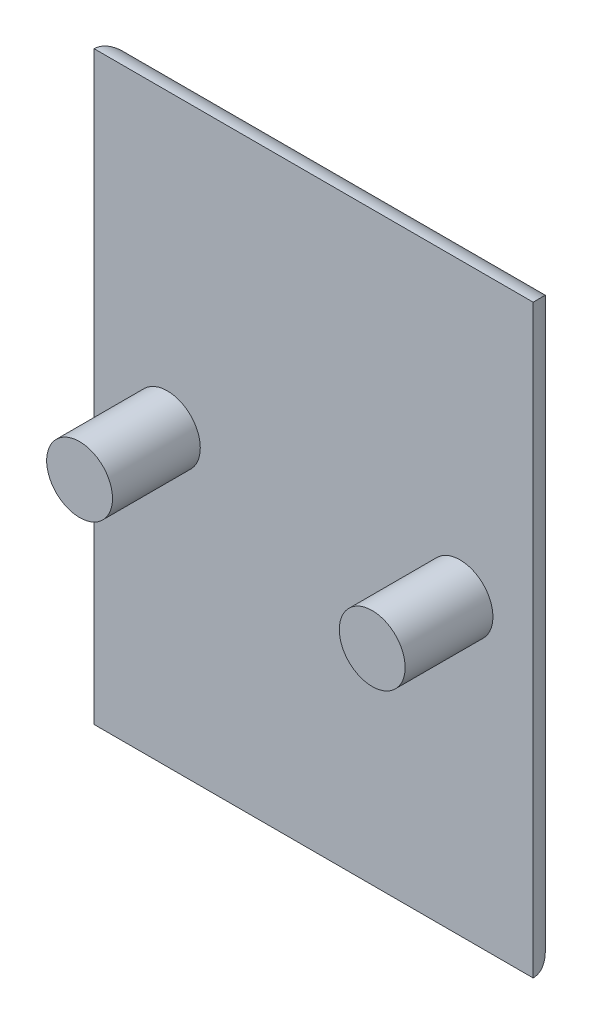
ISO-10303-21;
HEADER;
FILE_DESCRIPTION(('STEP AP214'),'2;1');
FILE_NAME('part.step','',(''),(''),'','','');
FILE_SCHEMA(('AUTOMOTIVE_DESIGN { 1 0 10303 214 1 1 1 1 }'));
ENDSEC;
DATA;
#1=APPLICATION_CONTEXT('core data for automotive mechanical design processes');
#2=APPLICATION_PROTOCOL_DEFINITION('international standard','automotive_design',2000,#1);
#3=PRODUCT_CONTEXT('',#1,'mechanical');
#4=PRODUCT('Part','Part','',(#3));
#5=PRODUCT_RELATED_PRODUCT_CATEGORY('part','',(#4));
#6=PRODUCT_DEFINITION_FORMATION('','',#4);
#7=PRODUCT_DEFINITION_CONTEXT('part definition',#1,'design');
#8=PRODUCT_DEFINITION('design','',#6,#7);
#9=PRODUCT_DEFINITION_SHAPE('','',#8);
#10=(LENGTH_UNIT() NAMED_UNIT(*) SI_UNIT(.MILLI.,.METRE.));
#11=(NAMED_UNIT(*) PLANE_ANGLE_UNIT() SI_UNIT($,.RADIAN.));
#12=(NAMED_UNIT(*) SI_UNIT($,.STERADIAN.) SOLID_ANGLE_UNIT());
#13=UNCERTAINTY_MEASURE_WITH_UNIT(LENGTH_MEASURE(1.E-05),#10,'distance_accuracy_value','');
#14=(GEOMETRIC_REPRESENTATION_CONTEXT(3) GLOBAL_UNCERTAINTY_ASSIGNED_CONTEXT((#13)) GLOBAL_UNIT_ASSIGNED_CONTEXT((#10,
#11,#12)) REPRESENTATION_CONTEXT('',''));
#15=CARTESIAN_POINT('',(0.,0.,0.));
#16=DIRECTION('',(0.,0.,1.));
#17=DIRECTION('',(1.,0.,0.));
#18=AXIS2_PLACEMENT_3D('',#15,#16,#17);
#19=CARTESIAN_POINT('',(0.,0.,2.));
#20=DIRECTION('',(0.,0.,1.));
#21=DIRECTION('',(1.,0.,0.));
#22=AXIS2_PLACEMENT_3D('',#19,#20,#21);
#23=PLANE('',#22);
#24=CARTESIAN_POINT('',(-10.,0.,2.));
#25=DIRECTION('',(0.,0.,1.));
#26=DIRECTION('',(1.,0.,0.));
#27=AXIS2_PLACEMENT_3D('',#24,#25,#26);
#28=CIRCLE('',#27,2.25);
#29=CARTESIAN_POINT('',(-7.75,0.,2.));
#30=VERTEX_POINT('',#29);
#31=EDGE_CURVE('E94',#30,#30,#28,.T.);
#32=ORIENTED_EDGE('',*,*,#31,.F.);
#33=EDGE_LOOP('',(#32));
#34=FACE_BOUND('',#33,.T.);
#35=DIRECTION('',(0.,1.,0.));
#36=VECTOR('',#35,1.);
#37=CARTESIAN_POINT('',(15.,20.,2.));
#38=LINE('',#37,#36);
#39=CARTESIAN_POINT('',(15.,-20.,2.));
#40=VERTEX_POINT('',#39);
#41=CARTESIAN_POINT('',(15.,20.,2.));
#42=VERTEX_POINT('',#41);
#43=EDGE_CURVE('E84',#40,#42,#38,.T.);
#44=ORIENTED_EDGE('',*,*,#43,.T.);
#45=DIRECTION('',(-1.,0.,0.));
#46=VECTOR('',#45,1.);
#47=CARTESIAN_POINT('',(-15.,20.,2.));
#48=LINE('',#47,#46);
#49=CARTESIAN_POINT('',(-15.,20.,2.));
#50=VERTEX_POINT('',#49);
#51=EDGE_CURVE('E88',#42,#50,#48,.T.);
#52=ORIENTED_EDGE('',*,*,#51,.T.);
#53=DIRECTION('',(0.,-1.,0.));
#54=VECTOR('',#53,1.);
#55=CARTESIAN_POINT('',(-15.,20.,2.));
#56=LINE('',#55,#54);
#57=CARTESIAN_POINT('',(-15.,-20.,2.));
#58=VERTEX_POINT('',#57);
#59=EDGE_CURVE('E107',#50,#58,#56,.T.);
#60=ORIENTED_EDGE('',*,*,#59,.T.);
#61=DIRECTION('',(1.,0.,0.));
#62=VECTOR('',#61,1.);
#63=CARTESIAN_POINT('',(-15.,-20.,2.));
#64=LINE('',#63,#62);
#65=EDGE_CURVE('E90',#58,#40,#64,.T.);
#66=ORIENTED_EDGE('',*,*,#65,.T.);
#67=EDGE_LOOP('',(#44,#52,#60,#66));
#68=FACE_BOUND('',#67,.T.);
#69=CARTESIAN_POINT('',(10.,0.,2.));
#70=DIRECTION('',(0.,0.,1.));
#71=DIRECTION('',(-1.,0.,0.));
#72=AXIS2_PLACEMENT_3D('',#69,#70,#71);
#73=CIRCLE('',#72,2.25);
#74=CARTESIAN_POINT('',(7.75,0.,2.));
#75=VERTEX_POINT('',#74);
#76=EDGE_CURVE('E125',#75,#75,#73,.T.);
#77=ORIENTED_EDGE('',*,*,#76,.F.);
#78=EDGE_LOOP('',(#77));
#79=FACE_BOUND('',#78,.T.);
#80=ADVANCED_FACE('F43',(#34,#68,#79),#23,.T.);
#81=CARTESIAN_POINT('',(0.,0.,0.));
#82=DIRECTION('',(0.,0.,1.));
#83=DIRECTION('',(1.,0.,0.));
#84=AXIS2_PLACEMENT_3D('',#81,#82,#83);
#85=PLANE('',#84);
#86=DIRECTION('',(0.,-1.,0.));
#87=VECTOR('',#86,1.);
#88=CARTESIAN_POINT('',(-13.,0.,0.));
#89=LINE('',#88,#87);
#90=CARTESIAN_POINT('',(-13.,-18.,0.));
#91=VERTEX_POINT('',#90);
#92=CARTESIAN_POINT('',(-13.,18.,0.));
#93=VERTEX_POINT('',#92);
#94=EDGE_CURVE('E52',#91,#93,#89,.F.);
#95=ORIENTED_EDGE('',*,*,#94,.T.);
#96=DIRECTION('',(-1.,0.,0.));
#97=VECTOR('',#96,1.);
#98=CARTESIAN_POINT('',(0.,18.,0.));
#99=LINE('',#98,#97);
#100=CARTESIAN_POINT('',(13.,18.,0.));
#101=VERTEX_POINT('',#100);
#102=EDGE_CURVE('E11',#93,#101,#99,.F.);
#103=ORIENTED_EDGE('',*,*,#102,.T.);
#104=DIRECTION('',(0.,1.,0.));
#105=VECTOR('',#104,1.);
#106=CARTESIAN_POINT('',(13.,0.,0.));
#107=LINE('',#106,#105);
#108=CARTESIAN_POINT('',(13.,-18.,0.));
#109=VERTEX_POINT('',#108);
#110=EDGE_CURVE('E99',#101,#109,#107,.F.);
#111=ORIENTED_EDGE('',*,*,#110,.T.);
#112=DIRECTION('',(1.,0.,0.));
#113=VECTOR('',#112,1.);
#114=CARTESIAN_POINT('',(0.,-18.,0.));
#115=LINE('',#114,#113);
#116=EDGE_CURVE('E63',#109,#91,#115,.F.);
#117=ORIENTED_EDGE('',*,*,#116,.T.);
#118=EDGE_LOOP('',(#95,#103,#111,#117));
#119=FACE_BOUND('',#118,.T.);
#120=ADVANCED_FACE('F136',(#119),#85,.F.);
#121=CARTESIAN_POINT('',(10.,0.,8.));
#122=DIRECTION('',(0.,0.,-1.));
#123=DIRECTION('',(-1.,0.,0.));
#124=AXIS2_PLACEMENT_3D('',#121,#122,#123);
#125=CYLINDRICAL_SURFACE('',#124,2.25);
#126=ORIENTED_EDGE('',*,*,#76,.T.);
#127=EDGE_LOOP('',(#126));
#128=FACE_BOUND('',#127,.T.);
#129=CARTESIAN_POINT('',(10.,0.,8.));
#130=DIRECTION('',(0.,0.,1.));
#131=DIRECTION('',(1.,0.,0.));
#132=AXIS2_PLACEMENT_3D('',#129,#130,#131);
#133=CIRCLE('',#132,2.25);
#134=CARTESIAN_POINT('',(12.25,0.,8.));
#135=VERTEX_POINT('',#134);
#136=EDGE_CURVE('E118',#135,#135,#133,.F.);
#137=ORIENTED_EDGE('',*,*,#136,.T.);
#138=EDGE_LOOP('',(#137));
#139=FACE_BOUND('',#138,.T.);
#140=ADVANCED_FACE('F142',(#128,#139),#125,.T.);
#141=CARTESIAN_POINT('',(0.,0.,8.));
#142=DIRECTION('',(0.,0.,1.));
#143=DIRECTION('',(1.,0.,0.));
#144=AXIS2_PLACEMENT_3D('',#141,#142,#143);
#145=PLANE('',#144);
#146=ORIENTED_EDGE('',*,*,#136,.F.);
#147=EDGE_LOOP('',(#146));
#148=FACE_BOUND('',#147,.T.);
#149=ADVANCED_FACE('F164',(#148),#145,.T.);
#150=CARTESIAN_POINT('',(-10.,0.,8.));
#151=DIRECTION('',(0.,0.,-1.));
#152=DIRECTION('',(-1.,0.,0.));
#153=AXIS2_PLACEMENT_3D('',#150,#151,#152);
#154=CYLINDRICAL_SURFACE('',#153,2.25);
#155=ORIENTED_EDGE('',*,*,#31,.T.);
#156=EDGE_LOOP('',(#155));
#157=FACE_BOUND('',#156,.T.);
#158=CARTESIAN_POINT('',(-10.,0.,8.));
#159=DIRECTION('',(0.,0.,1.));
#160=DIRECTION('',(1.,0.,0.));
#161=AXIS2_PLACEMENT_3D('',#158,#159,#160);
#162=CIRCLE('',#161,2.25);
#163=CARTESIAN_POINT('',(-7.75,0.,8.));
#164=VERTEX_POINT('',#163);
#165=EDGE_CURVE('E120',#164,#164,#162,.T.);
#166=ORIENTED_EDGE('',*,*,#165,.F.);
#167=EDGE_LOOP('',(#166));
#168=FACE_BOUND('',#167,.T.);
#169=ADVANCED_FACE('F132',(#157,#168),#154,.T.);
#170=CARTESIAN_POINT('',(0.,0.,8.));
#171=DIRECTION('',(0.,0.,1.));
#172=DIRECTION('',(1.,0.,0.));
#173=AXIS2_PLACEMENT_3D('',#170,#171,#172);
#174=PLANE('',#173);
#175=ORIENTED_EDGE('',*,*,#165,.T.);
#176=EDGE_LOOP('',(#175));
#177=FACE_BOUND('',#176,.T.);
#178=ADVANCED_FACE('F155',(#177),#174,.T.);
#179=CARTESIAN_POINT('',(-15.,-18.,2.));
#180=DIRECTION('',(1.,0.,0.));
#181=DIRECTION('',(0.,0.,-1.));
#182=AXIS2_PLACEMENT_3D('',#179,#180,#181);
#183=CYLINDRICAL_SURFACE('',#182,2.);
#184=CARTESIAN_POINT('',(-13.,-18.,2.));
#185=DIRECTION('',(0.707106781186547,-0.707106781186547,0.));
#186=DIRECTION('',(0.707106781186547,0.707106781186547,0.));
#187=AXIS2_PLACEMENT_3D('',#184,#185,#186);
#188=ELLIPSE('',#187,2.82842712474619,2.);
#189=EDGE_CURVE('E101',#91,#58,#188,.F.);
#190=ORIENTED_EDGE('',*,*,#189,.F.);
#191=ORIENTED_EDGE('',*,*,#116,.F.);
#192=CARTESIAN_POINT('',(13.,-18.,2.));
#193=DIRECTION('',(0.707106781186547,0.707106781186547,0.));
#194=DIRECTION('',(-0.707106781186547,0.707106781186547,0.));
#195=AXIS2_PLACEMENT_3D('',#192,#193,#194);
#196=ELLIPSE('',#195,2.82842712474619,2.);
#197=EDGE_CURVE('E47',#40,#109,#196,.T.);
#198=ORIENTED_EDGE('',*,*,#197,.F.);
#199=ORIENTED_EDGE('',*,*,#65,.F.);
#200=EDGE_LOOP('',(#190,#191,#198,#199));
#201=FACE_BOUND('',#200,.T.);
#202=ADVANCED_FACE('F45',(#201),#183,.T.);
#203=CARTESIAN_POINT('',(13.,20.,2.));
#204=DIRECTION('',(0.,1.,0.));
#205=DIRECTION('',(0.,0.,1.));
#206=AXIS2_PLACEMENT_3D('',#203,#204,#205);
#207=CYLINDRICAL_SURFACE('',#206,2.);
#208=ORIENTED_EDGE('',*,*,#197,.T.);
#209=ORIENTED_EDGE('',*,*,#110,.F.);
#210=CARTESIAN_POINT('',(13.,18.,2.));
#211=DIRECTION('',(-0.707106781186547,0.707106781186547,0.));
#212=DIRECTION('',(0.707106781186547,0.707106781186547,0.));
#213=AXIS2_PLACEMENT_3D('',#210,#211,#212);
#214=ELLIPSE('',#213,2.82842712474619,2.);
#215=EDGE_CURVE('E97',#42,#101,#214,.T.);
#216=ORIENTED_EDGE('',*,*,#215,.F.);
#217=ORIENTED_EDGE('',*,*,#43,.F.);
#218=EDGE_LOOP('',(#208,#209,#216,#217));
#219=FACE_BOUND('',#218,.T.);
#220=ADVANCED_FACE('F98',(#219),#207,.T.);
#221=CARTESIAN_POINT('',(-13.,20.,2.));
#222=DIRECTION('',(0.,-1.,0.));
#223=DIRECTION('',(0.,0.,-1.));
#224=AXIS2_PLACEMENT_3D('',#221,#222,#223);
#225=CYLINDRICAL_SURFACE('',#224,2.);
#226=ORIENTED_EDGE('',*,*,#189,.T.);
#227=ORIENTED_EDGE('',*,*,#59,.F.);
#228=CARTESIAN_POINT('',(-13.,18.,2.));
#229=DIRECTION('',(-0.707106781186547,-0.707106781186547,0.));
#230=DIRECTION('',(0.707106781186547,-0.707106781186547,0.));
#231=AXIS2_PLACEMENT_3D('',#228,#229,#230);
#232=ELLIPSE('',#231,2.82842712474619,2.);
#233=EDGE_CURVE('E102',#93,#50,#232,.F.);
#234=ORIENTED_EDGE('',*,*,#233,.F.);
#235=ORIENTED_EDGE('',*,*,#94,.F.);
#236=EDGE_LOOP('',(#226,#227,#234,#235));
#237=FACE_BOUND('',#236,.T.);
#238=ADVANCED_FACE('F149',(#237),#225,.T.);
#239=CARTESIAN_POINT('',(-15.,18.,2.));
#240=DIRECTION('',(-1.,0.,0.));
#241=DIRECTION('',(0.,0.,1.));
#242=AXIS2_PLACEMENT_3D('',#239,#240,#241);
#243=CYLINDRICAL_SURFACE('',#242,2.);
#244=ORIENTED_EDGE('',*,*,#215,.T.);
#245=ORIENTED_EDGE('',*,*,#102,.F.);
#246=ORIENTED_EDGE('',*,*,#233,.T.);
#247=ORIENTED_EDGE('',*,*,#51,.F.);
#248=EDGE_LOOP('',(#244,#245,#246,#247));
#249=FACE_BOUND('',#248,.T.);
#250=ADVANCED_FACE('F104',(#249),#243,.T.);
#251=CLOSED_SHELL('',(#80,#120,#140,#149,#169,#178,#202,#220,#238,#250));
#252=MANIFOLD_SOLID_BREP('B2',#251);
#253=ADVANCED_BREP_SHAPE_REPRESENTATION('',(#18,#252),#14);
#254=SHAPE_DEFINITION_REPRESENTATION(#9,#253);
ENDSEC;
END-ISO-10303-21;
